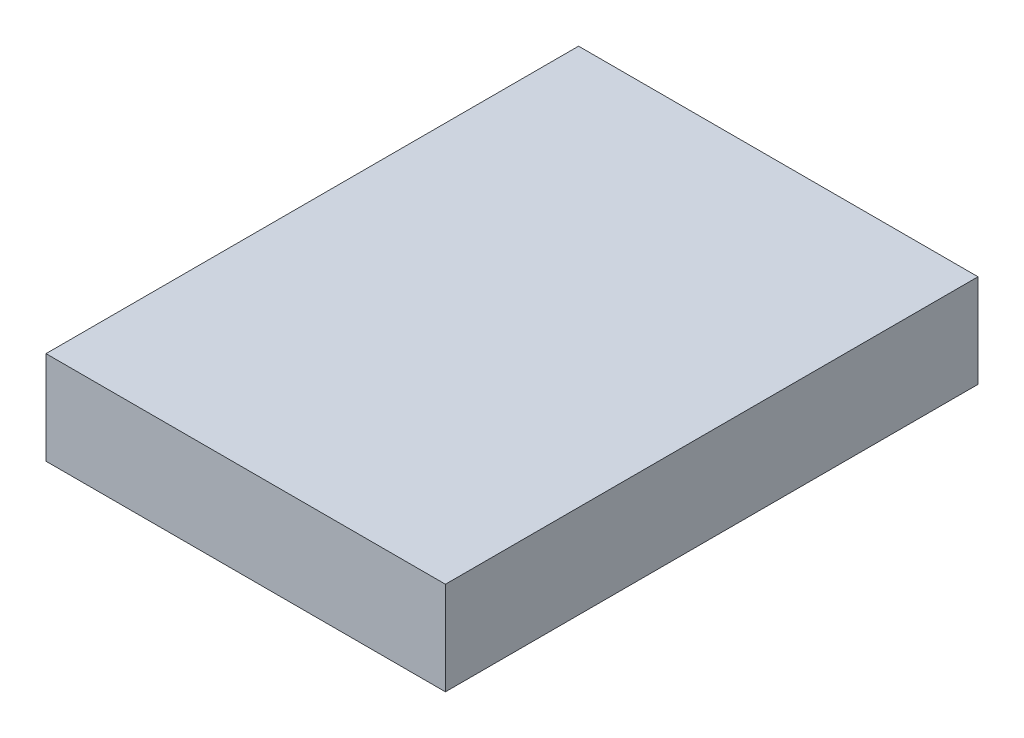
ISO-10303-21;
HEADER;
FILE_DESCRIPTION(('STEP AP214'),'2;1');
FILE_NAME('part.step','',(''),(''),'','','');
FILE_SCHEMA(('AUTOMOTIVE_DESIGN { 1 0 10303 214 1 1 1 1 }'));
ENDSEC;
DATA;
#1=APPLICATION_CONTEXT('core data for automotive mechanical design processes');
#2=APPLICATION_PROTOCOL_DEFINITION('international standard','automotive_design',2000,#1);
#3=PRODUCT_CONTEXT('',#1,'mechanical');
#4=PRODUCT('Part','Part','',(#3));
#5=PRODUCT_RELATED_PRODUCT_CATEGORY('part','',(#4));
#6=PRODUCT_DEFINITION_FORMATION('','',#4);
#7=PRODUCT_DEFINITION_CONTEXT('part definition',#1,'design');
#8=PRODUCT_DEFINITION('design','',#6,#7);
#9=PRODUCT_DEFINITION_SHAPE('','',#8);
#10=(LENGTH_UNIT() NAMED_UNIT(*) SI_UNIT(.MILLI.,.METRE.));
#11=(NAMED_UNIT(*) PLANE_ANGLE_UNIT() SI_UNIT($,.RADIAN.));
#12=(NAMED_UNIT(*) SI_UNIT($,.STERADIAN.) SOLID_ANGLE_UNIT());
#13=UNCERTAINTY_MEASURE_WITH_UNIT(LENGTH_MEASURE(1.E-05),#10,'distance_accuracy_value','');
#14=(GEOMETRIC_REPRESENTATION_CONTEXT(3) GLOBAL_UNCERTAINTY_ASSIGNED_CONTEXT((#13)) GLOBAL_UNIT_ASSIGNED_CONTEXT((#10,
#11,#12)) REPRESENTATION_CONTEXT('',''));
#15=CARTESIAN_POINT('',(0.,0.,0.));
#16=DIRECTION('',(0.,0.,1.));
#17=DIRECTION('',(1.,0.,0.));
#18=AXIS2_PLACEMENT_3D('',#15,#16,#17);
#19=CARTESIAN_POINT('',(0.,0.,0.));
#20=DIRECTION('',(0.,1.,0.));
#21=DIRECTION('',(0.,0.,1.));
#22=AXIS2_PLACEMENT_3D('',#19,#20,#21);
#23=PLANE('',#22);
#24=DIRECTION('',(-1.,0.,0.));
#25=VECTOR('',#24,1.);
#26=CARTESIAN_POINT('',(-1.5,0.,2.));
#27=LINE('',#26,#25);
#28=CARTESIAN_POINT('',(1.5,0.,2.));
#29=VERTEX_POINT('',#28);
#30=CARTESIAN_POINT('',(-1.5,0.,2.));
#31=VERTEX_POINT('',#30);
#32=EDGE_CURVE('E81',#29,#31,#27,.T.);
#33=ORIENTED_EDGE('',*,*,#32,.T.);
#34=DIRECTION('',(0.,0.,-1.));
#35=VECTOR('',#34,1.);
#36=CARTESIAN_POINT('',(-1.5,0.,-2.));
#37=LINE('',#36,#35);
#38=CARTESIAN_POINT('',(-1.5,0.,-2.));
#39=VERTEX_POINT('',#38);
#40=EDGE_CURVE('E68',#31,#39,#37,.T.);
#41=ORIENTED_EDGE('',*,*,#40,.T.);
#42=DIRECTION('',(1.,0.,0.));
#43=VECTOR('',#42,1.);
#44=CARTESIAN_POINT('',(-1.5,0.,-2.));
#45=LINE('',#44,#43);
#46=CARTESIAN_POINT('',(1.5,0.,-2.));
#47=VERTEX_POINT('',#46);
#48=EDGE_CURVE('E55',#39,#47,#45,.T.);
#49=ORIENTED_EDGE('',*,*,#48,.T.);
#50=DIRECTION('',(0.,0.,1.));
#51=VECTOR('',#50,1.);
#52=CARTESIAN_POINT('',(1.5,0.,-2.));
#53=LINE('',#52,#51);
#54=EDGE_CURVE('E20',#47,#29,#53,.T.);
#55=ORIENTED_EDGE('',*,*,#54,.T.);
#56=EDGE_LOOP('',(#33,#41,#49,#55));
#57=FACE_BOUND('',#56,.T.);
#58=ADVANCED_FACE('F17',(#57),#23,.F.);
#59=CARTESIAN_POINT('',(1.5,0.7,-2.));
#60=DIRECTION('',(-1.,0.,0.));
#61=DIRECTION('',(0.,0.,1.));
#62=AXIS2_PLACEMENT_3D('',#59,#60,#61);
#63=PLANE('',#62);
#64=DIRECTION('',(0.,1.,0.));
#65=VECTOR('',#64,1.);
#66=CARTESIAN_POINT('',(1.5,0.7,-2.));
#67=LINE('',#66,#65);
#68=CARTESIAN_POINT('',(1.5,0.7,-2.));
#69=VERTEX_POINT('',#68);
#70=EDGE_CURVE('E61',#47,#69,#67,.T.);
#71=ORIENTED_EDGE('',*,*,#70,.T.);
#72=DIRECTION('',(0.,0.,1.));
#73=VECTOR('',#72,1.);
#74=CARTESIAN_POINT('',(1.5,0.7,0.));
#75=LINE('',#74,#73);
#76=CARTESIAN_POINT('',(1.5,0.7,2.));
#77=VERTEX_POINT('',#76);
#78=EDGE_CURVE('E83',#77,#69,#75,.F.);
#79=ORIENTED_EDGE('',*,*,#78,.F.);
#80=DIRECTION('',(0.,1.,0.));
#81=VECTOR('',#80,1.);
#82=CARTESIAN_POINT('',(1.5,0.7,2.));
#83=LINE('',#82,#81);
#84=EDGE_CURVE('E64',#77,#29,#83,.F.);
#85=ORIENTED_EDGE('',*,*,#84,.T.);
#86=ORIENTED_EDGE('',*,*,#54,.F.);
#87=EDGE_LOOP('',(#71,#79,#85,#86));
#88=FACE_BOUND('',#87,.T.);
#89=ADVANCED_FACE('F60',(#88),#63,.F.);
#90=CARTESIAN_POINT('',(-1.5,0.7,-2.));
#91=DIRECTION('',(0.,0.,1.));
#92=DIRECTION('',(1.,0.,0.));
#93=AXIS2_PLACEMENT_3D('',#90,#91,#92);
#94=PLANE('',#93);
#95=DIRECTION('',(0.,1.,0.));
#96=VECTOR('',#95,1.);
#97=CARTESIAN_POINT('',(-1.5,0.7,-2.));
#98=LINE('',#97,#96);
#99=CARTESIAN_POINT('',(-1.5,0.7,-2.));
#100=VERTEX_POINT('',#99);
#101=EDGE_CURVE('E70',#39,#100,#98,.T.);
#102=ORIENTED_EDGE('',*,*,#101,.T.);
#103=DIRECTION('',(1.,0.,0.));
#104=VECTOR('',#103,1.);
#105=CARTESIAN_POINT('',(0.,0.7,-2.));
#106=LINE('',#105,#104);
#107=EDGE_CURVE('E74',#69,#100,#106,.F.);
#108=ORIENTED_EDGE('',*,*,#107,.F.);
#109=ORIENTED_EDGE('',*,*,#70,.F.);
#110=ORIENTED_EDGE('',*,*,#48,.F.);
#111=EDGE_LOOP('',(#102,#108,#109,#110));
#112=FACE_BOUND('',#111,.T.);
#113=ADVANCED_FACE('F72',(#112),#94,.F.);
#114=CARTESIAN_POINT('',(-1.5,0.7,-2.));
#115=DIRECTION('',(1.,0.,0.));
#116=DIRECTION('',(0.,0.,-1.));
#117=AXIS2_PLACEMENT_3D('',#114,#115,#116);
#118=PLANE('',#117);
#119=DIRECTION('',(0.,1.,0.));
#120=VECTOR('',#119,1.);
#121=CARTESIAN_POINT('',(-1.5,0.7,2.));
#122=LINE('',#121,#120);
#123=CARTESIAN_POINT('',(-1.5,0.7,2.));
#124=VERTEX_POINT('',#123);
#125=EDGE_CURVE('E35',#31,#124,#122,.T.);
#126=ORIENTED_EDGE('',*,*,#125,.T.);
#127=DIRECTION('',(0.,0.,1.));
#128=VECTOR('',#127,1.);
#129=CARTESIAN_POINT('',(-1.5,0.7,0.));
#130=LINE('',#129,#128);
#131=EDGE_CURVE('E26',#100,#124,#130,.T.);
#132=ORIENTED_EDGE('',*,*,#131,.F.);
#133=ORIENTED_EDGE('',*,*,#101,.F.);
#134=ORIENTED_EDGE('',*,*,#40,.F.);
#135=EDGE_LOOP('',(#126,#132,#133,#134));
#136=FACE_BOUND('',#135,.T.);
#137=ADVANCED_FACE('F89',(#136),#118,.F.);
#138=CARTESIAN_POINT('',(-1.5,0.7,2.));
#139=DIRECTION('',(0.,0.,-1.));
#140=DIRECTION('',(-1.,0.,0.));
#141=AXIS2_PLACEMENT_3D('',#138,#139,#140);
#142=PLANE('',#141);
#143=ORIENTED_EDGE('',*,*,#84,.F.);
#144=DIRECTION('',(1.,0.,0.));
#145=VECTOR('',#144,1.);
#146=CARTESIAN_POINT('',(0.,0.7,2.));
#147=LINE('',#146,#145);
#148=EDGE_CURVE('E11',#124,#77,#147,.T.);
#149=ORIENTED_EDGE('',*,*,#148,.F.);
#150=ORIENTED_EDGE('',*,*,#125,.F.);
#151=ORIENTED_EDGE('',*,*,#32,.F.);
#152=EDGE_LOOP('',(#143,#149,#150,#151));
#153=FACE_BOUND('',#152,.T.);
#154=ADVANCED_FACE('F91',(#153),#142,.F.);
#155=CARTESIAN_POINT('',(0.,0.7,0.));
#156=DIRECTION('',(0.,1.,0.));
#157=DIRECTION('',(0.,0.,1.));
#158=AXIS2_PLACEMENT_3D('',#155,#156,#157);
#159=PLANE('',#158);
#160=ORIENTED_EDGE('',*,*,#131,.T.);
#161=ORIENTED_EDGE('',*,*,#148,.T.);
#162=ORIENTED_EDGE('',*,*,#78,.T.);
#163=ORIENTED_EDGE('',*,*,#107,.T.);
#164=EDGE_LOOP('',(#160,#161,#162,#163));
#165=FACE_BOUND('',#164,.T.);
#166=ADVANCED_FACE('F88',(#165),#159,.T.);
#167=CLOSED_SHELL('',(#58,#89,#113,#137,#154,#166));
#168=MANIFOLD_SOLID_BREP('B1',#167);
#169=ADVANCED_BREP_SHAPE_REPRESENTATION('',(#18,#168),#14);
#170=SHAPE_DEFINITION_REPRESENTATION(#9,#169);
ENDSEC;
END-ISO-10303-21;
